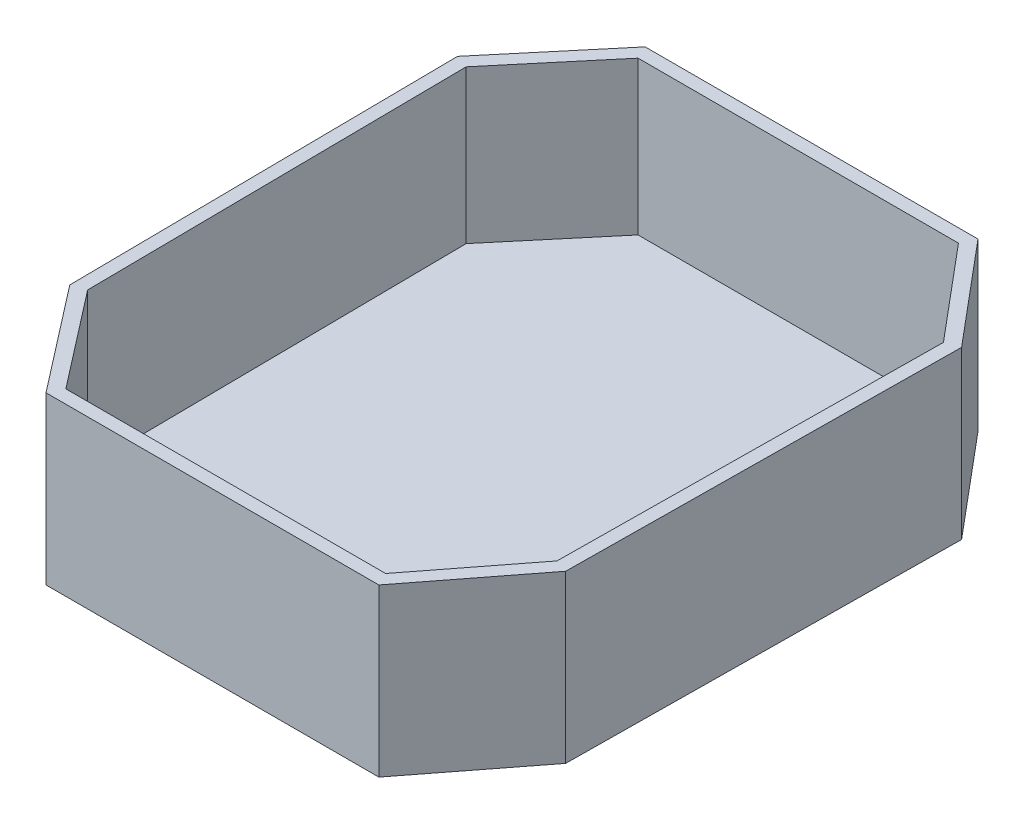
ISO-10303-21;
HEADER;
FILE_DESCRIPTION(('STEP AP214'),'2;1');
FILE_NAME('part.step','',(''),(''),'','','');
FILE_SCHEMA(('AUTOMOTIVE_DESIGN { 1 0 10303 214 1 1 1 1 }'));
ENDSEC;
DATA;
#1=APPLICATION_CONTEXT('core data for automotive mechanical design processes');
#2=APPLICATION_PROTOCOL_DEFINITION('international standard','automotive_design',2000,#1);
#3=PRODUCT_CONTEXT('',#1,'mechanical');
#4=PRODUCT('Part','Part','',(#3));
#5=PRODUCT_RELATED_PRODUCT_CATEGORY('part','',(#4));
#6=PRODUCT_DEFINITION_FORMATION('','',#4);
#7=PRODUCT_DEFINITION_CONTEXT('part definition',#1,'design');
#8=PRODUCT_DEFINITION('design','',#6,#7);
#9=PRODUCT_DEFINITION_SHAPE('','',#8);
#10=(LENGTH_UNIT() NAMED_UNIT(*) SI_UNIT(.MILLI.,.METRE.));
#11=(NAMED_UNIT(*) PLANE_ANGLE_UNIT() SI_UNIT($,.RADIAN.));
#12=(NAMED_UNIT(*) SI_UNIT($,.STERADIAN.) SOLID_ANGLE_UNIT());
#13=UNCERTAINTY_MEASURE_WITH_UNIT(LENGTH_MEASURE(1.E-05),#10,'distance_accuracy_value','');
#14=(GEOMETRIC_REPRESENTATION_CONTEXT(3) GLOBAL_UNCERTAINTY_ASSIGNED_CONTEXT((#13)) GLOBAL_UNIT_ASSIGNED_CONTEXT((#10,
#11,#12)) REPRESENTATION_CONTEXT('',''));
#15=CARTESIAN_POINT('',(0.,0.,0.));
#16=DIRECTION('',(0.,0.,1.));
#17=DIRECTION('',(1.,0.,0.));
#18=AXIS2_PLACEMENT_3D('',#15,#16,#17);
#19=CARTESIAN_POINT('',(0.,25.,0.));
#20=DIRECTION('',(0.,-1.,0.));
#21=DIRECTION('',(0.,0.,-1.));
#22=AXIS2_PLACEMENT_3D('',#19,#20,#21);
#23=PLANE('',#22);
#24=DIRECTION('',(1.,0.,0.));
#25=VECTOR('',#24,1.);
#26=CARTESIAN_POINT('',(0.,25.,50.1713553762138));
#27=LINE('',#26,#25);
#28=CARTESIAN_POINT('',(-25.,25.,50.1713553762139));
#29=VERTEX_POINT('',#28);
#30=CARTESIAN_POINT('',(25.,25.,50.1713553762139));
#31=VERTEX_POINT('',#30);
#32=EDGE_CURVE('E265',#29,#31,#27,.T.);
#33=ORIENTED_EDGE('',*,*,#32,.T.);
#34=DIRECTION('',(-0.612214149349161,0.,0.790691997769475));
#35=VECTOR('',#34,1.);
#36=CARTESIAN_POINT('',(25.,25.,50.1713553762139));
#37=LINE('',#36,#35);
#38=CARTESIAN_POINT('',(37.2442829869832,25.,34.3575154208243));
#39=VERTEX_POINT('',#38);
#40=EDGE_CURVE('E230',#39,#31,#37,.T.);
#41=ORIENTED_EDGE('',*,*,#40,.F.);
#42=DIRECTION('',(-0.0103870449869071,0.,0.999946053193091));
#43=VECTOR('',#42,1.);
#44=CARTESIAN_POINT('',(37.2442829869832,25.,34.3575154208243));
#45=LINE('',#44,#43);
#46=CARTESIAN_POINT('',(37.8557521937308,25.,-24.5077557614065));
#47=VERTEX_POINT('',#46);
#48=EDGE_CURVE('E233',#47,#39,#45,.T.);
#49=ORIENTED_EDGE('',*,*,#48,.F.);
#50=DIRECTION('',(0.642787609686537,0.,0.76604444311898));
#51=VECTOR('',#50,1.);
#52=CARTESIAN_POINT('',(37.8557521937308,25.,-24.5077557614065));
#53=LINE('',#52,#51);
#54=CARTESIAN_POINT('',(25.,25.,-39.8286446237862));
#55=VERTEX_POINT('',#54);
#56=EDGE_CURVE('E237',#55,#47,#53,.T.);
#57=ORIENTED_EDGE('',*,*,#56,.F.);
#58=DIRECTION('',(-1.,0.,0.));
#59=VECTOR('',#58,1.);
#60=CARTESIAN_POINT('',(-25.,25.,-39.8286446237862));
#61=LINE('',#60,#59);
#62=CARTESIAN_POINT('',(-25.,25.,-39.8286446237862));
#63=VERTEX_POINT('',#62);
#64=EDGE_CURVE('E89',#55,#63,#61,.T.);
#65=ORIENTED_EDGE('',*,*,#64,.T.);
#66=DIRECTION('',(-0.642787609686537,0.,0.76604444311898));
#67=VECTOR('',#66,1.);
#68=CARTESIAN_POINT('',(-37.8557521937308,25.,-24.5077557614065));
#69=LINE('',#68,#67);
#70=CARTESIAN_POINT('',(-37.8557521937308,25.,-24.5077557614065));
#71=VERTEX_POINT('',#70);
#72=EDGE_CURVE('E259',#63,#71,#69,.T.);
#73=ORIENTED_EDGE('',*,*,#72,.T.);
#74=DIRECTION('',(0.0103870449869071,0.,0.999946053193091));
#75=VECTOR('',#74,1.);
#76=CARTESIAN_POINT('',(-37.2442829869832,25.,34.3575154208243));
#77=LINE('',#76,#75);
#78=CARTESIAN_POINT('',(-37.2442829869832,25.,34.3575154208243));
#79=VERTEX_POINT('',#78);
#80=EDGE_CURVE('E262',#71,#79,#77,.T.);
#81=ORIENTED_EDGE('',*,*,#80,.T.);
#82=DIRECTION('',(0.612214149349161,0.,0.790691997769475));
#83=VECTOR('',#82,1.);
#84=CARTESIAN_POINT('',(-25.,25.,50.1713553762139));
#85=LINE('',#84,#83);
#86=EDGE_CURVE('E61',#79,#29,#85,.T.);
#87=ORIENTED_EDGE('',*,*,#86,.T.);
#88=EDGE_LOOP('',(#33,#41,#49,#57,#65,#73,#81,#87));
#89=FACE_BOUND('',#88,.T.);
#90=DIRECTION('',(1.,0.,0.));
#91=VECTOR('',#90,1.);
#92=CARTESIAN_POINT('',(0.,25.,48.1713553762138));
#93=LINE('',#92,#91);
#94=CARTESIAN_POINT('',(-24.0191228651744,25.,48.1713553762139));
#95=VERTEX_POINT('',#94);
#96=CARTESIAN_POINT('',(24.0191228651744,25.,48.1713553762138));
#97=VERTEX_POINT('',#96);
#98=EDGE_CURVE('E198',#95,#97,#93,.T.);
#99=ORIENTED_EDGE('',*,*,#98,.F.);
#100=DIRECTION('',(0.612214149349161,0.,0.790691997769475));
#101=VECTOR('',#100,1.);
#102=CARTESIAN_POINT('',(-38.3350518101554,25.,29.6819257061113));
#103=LINE('',#102,#101);
#104=CARTESIAN_POINT('',(-35.2513729786307,25.,33.6645846798867));
#105=VERTEX_POINT('',#104);
#106=EDGE_CURVE('E219',#105,#95,#103,.T.);
#107=ORIENTED_EDGE('',*,*,#106,.F.);
#108=DIRECTION('',(0.0103870449869071,0.,0.999946053193091));
#109=VECTOR('',#108,1.);
#110=CARTESIAN_POINT('',(-35.5972263748545,25.,0.369769939672266));
#111=LINE('',#110,#109);
#112=CARTESIAN_POINT('',(-35.8481765187902,25.,-23.7888436307009));
#113=VERTEX_POINT('',#112);
#114=EDGE_CURVE('E217',#113,#105,#111,.T.);
#115=ORIENTED_EDGE('',*,*,#114,.F.);
#116=DIRECTION('',(-0.642787609686537,0.,0.76604444311898));
#117=VECTOR('',#116,1.);
#118=CARTESIAN_POINT('',(-32.750292343335,25.,-27.4807582262404));
#119=LINE('',#118,#117);
#120=CARTESIAN_POINT('',(-24.06738468369,25.,-37.8286446237861));
#121=VERTEX_POINT('',#120);
#122=EDGE_CURVE('E215',#121,#113,#119,.T.);
#123=ORIENTED_EDGE('',*,*,#122,.F.);
#124=DIRECTION('',(-1.,0.,0.));
#125=VECTOR('',#124,1.);
#126=CARTESIAN_POINT('',(0.,25.,-37.8286446237861));
#127=LINE('',#126,#125);
#128=CARTESIAN_POINT('',(24.06738468369,25.,-37.8286446237861));
#129=VERTEX_POINT('',#128);
#130=EDGE_CURVE('E175',#129,#121,#127,.T.);
#131=ORIENTED_EDGE('',*,*,#130,.F.);
#132=DIRECTION('',(0.642787609686537,0.,0.76604444311898));
#133=VECTOR('',#132,1.);
#134=CARTESIAN_POINT('',(32.750292343335,25.,-27.4807582262404));
#135=LINE('',#134,#133);
#136=CARTESIAN_POINT('',(35.8481765187902,25.,-23.7888436307009));
#137=VERTEX_POINT('',#136);
#138=EDGE_CURVE('E227',#129,#137,#135,.T.);
#139=ORIENTED_EDGE('',*,*,#138,.T.);
#140=DIRECTION('',(-0.0103870449869071,0.,0.999946053193091));
#141=VECTOR('',#140,1.);
#142=CARTESIAN_POINT('',(35.5972263748545,25.,0.369769939672266));
#143=LINE('',#142,#141);
#144=CARTESIAN_POINT('',(35.2513729786307,25.,33.6645846798867));
#145=VERTEX_POINT('',#144);
#146=EDGE_CURVE('E224',#137,#145,#143,.T.);
#147=ORIENTED_EDGE('',*,*,#146,.T.);
#148=DIRECTION('',(-0.612214149349161,0.,0.790691997769475));
#149=VECTOR('',#148,1.);
#150=CARTESIAN_POINT('',(38.3350518101554,25.,29.6819257061113));
#151=LINE('',#150,#149);
#152=EDGE_CURVE('E204',#145,#97,#151,.T.);
#153=ORIENTED_EDGE('',*,*,#152,.T.);
#154=EDGE_LOOP('',(#99,#107,#115,#123,#131,#139,#147,#153));
#155=FACE_BOUND('',#154,.T.);
#156=ADVANCED_FACE('F37',(#89,#155),#23,.F.);
#157=CARTESIAN_POINT('',(-25.,25.,-39.8286446237862));
#158=DIRECTION('',(0.,0.,1.));
#159=DIRECTION('',(1.,0.,0.));
#160=AXIS2_PLACEMENT_3D('',#157,#158,#159);
#161=PLANE('',#160);
#162=DIRECTION('',(-1.,0.,0.));
#163=VECTOR('',#162,1.);
#164=CARTESIAN_POINT('',(-25.,0.,-39.8286446237862));
#165=LINE('',#164,#163);
#166=CARTESIAN_POINT('',(25.,0.,-39.8286446237862));
#167=VERTEX_POINT('',#166);
#168=CARTESIAN_POINT('',(-25.,0.,-39.8286446237862));
#169=VERTEX_POINT('',#168);
#170=EDGE_CURVE('E257',#167,#169,#165,.T.);
#171=ORIENTED_EDGE('',*,*,#170,.T.);
#172=DIRECTION('',(0.,-1.,0.));
#173=VECTOR('',#172,1.);
#174=CARTESIAN_POINT('',(-25.,25.,-39.8286446237862));
#175=LINE('',#174,#173);
#176=EDGE_CURVE('E11',#63,#169,#175,.T.);
#177=ORIENTED_EDGE('',*,*,#176,.F.);
#178=ORIENTED_EDGE('',*,*,#64,.F.);
#179=DIRECTION('',(0.,-1.,0.));
#180=VECTOR('',#179,1.);
#181=CARTESIAN_POINT('',(25.,25.,-39.8286446237862));
#182=LINE('',#181,#180);
#183=EDGE_CURVE('E240',#55,#167,#182,.T.);
#184=ORIENTED_EDGE('',*,*,#183,.T.);
#185=EDGE_LOOP('',(#171,#177,#178,#184));
#186=FACE_BOUND('',#185,.T.);
#187=ADVANCED_FACE('F39',(#186),#161,.F.);
#188=CARTESIAN_POINT('',(-37.8557521937308,25.,-24.5077557614065));
#189=DIRECTION('',(0.76604444311898,0.,0.642787609686537));
#190=DIRECTION('',(0.642787609686537,0.,-0.76604444311898));
#191=AXIS2_PLACEMENT_3D('',#188,#189,#190);
#192=PLANE('',#191);
#193=DIRECTION('',(-0.642787609686537,0.,0.76604444311898));
#194=VECTOR('',#193,1.);
#195=CARTESIAN_POINT('',(-37.8557521937308,0.,-24.5077557614065));
#196=LINE('',#195,#194);
#197=CARTESIAN_POINT('',(-37.8557521937308,0.,-24.5077557614065));
#198=VERTEX_POINT('',#197);
#199=EDGE_CURVE('E269',#169,#198,#196,.T.);
#200=ORIENTED_EDGE('',*,*,#199,.T.);
#201=DIRECTION('',(0.,-1.,0.));
#202=VECTOR('',#201,1.);
#203=CARTESIAN_POINT('',(-37.8557521937308,25.,-24.5077557614065));
#204=LINE('',#203,#202);
#205=EDGE_CURVE('E45',#71,#198,#204,.T.);
#206=ORIENTED_EDGE('',*,*,#205,.F.);
#207=ORIENTED_EDGE('',*,*,#72,.F.);
#208=ORIENTED_EDGE('',*,*,#176,.T.);
#209=EDGE_LOOP('',(#200,#206,#207,#208));
#210=FACE_BOUND('',#209,.T.);
#211=ADVANCED_FACE('F308',(#210),#192,.F.);
#212=CARTESIAN_POINT('',(-37.2442829869832,25.,34.3575154208243));
#213=DIRECTION('',(0.999946053193091,0.,-0.0103870449869071));
#214=DIRECTION('',(-0.0103870449869071,0.,-0.999946053193091));
#215=AXIS2_PLACEMENT_3D('',#212,#213,#214);
#216=PLANE('',#215);
#217=DIRECTION('',(0.0103870449869071,0.,0.999946053193091));
#218=VECTOR('',#217,1.);
#219=CARTESIAN_POINT('',(-37.2442829869832,0.,34.3575154208243));
#220=LINE('',#219,#218);
#221=CARTESIAN_POINT('',(-37.2442829869832,0.,34.3575154208243));
#222=VERTEX_POINT('',#221);
#223=EDGE_CURVE('E271',#198,#222,#220,.T.);
#224=ORIENTED_EDGE('',*,*,#223,.T.);
#225=DIRECTION('',(0.,-1.,0.));
#226=VECTOR('',#225,1.);
#227=CARTESIAN_POINT('',(-37.2442829869832,25.,34.3575154208243));
#228=LINE('',#227,#226);
#229=EDGE_CURVE('E276',#79,#222,#228,.T.);
#230=ORIENTED_EDGE('',*,*,#229,.F.);
#231=ORIENTED_EDGE('',*,*,#80,.F.);
#232=ORIENTED_EDGE('',*,*,#205,.T.);
#233=EDGE_LOOP('',(#224,#230,#231,#232));
#234=FACE_BOUND('',#233,.T.);
#235=ADVANCED_FACE('F282',(#234),#216,.F.);
#236=CARTESIAN_POINT('',(-25.,25.,50.1713553762139));
#237=DIRECTION('',(0.790691997769475,0.,-0.612214149349161));
#238=DIRECTION('',(-0.612214149349161,0.,-0.790691997769475));
#239=AXIS2_PLACEMENT_3D('',#236,#237,#238);
#240=PLANE('',#239);
#241=DIRECTION('',(0.612214149349161,0.,0.790691997769475));
#242=VECTOR('',#241,1.);
#243=CARTESIAN_POINT('',(-25.,0.,50.1713553762139));
#244=LINE('',#243,#242);
#245=CARTESIAN_POINT('',(-25.,0.,50.1713553762139));
#246=VERTEX_POINT('',#245);
#247=EDGE_CURVE('E82',#222,#246,#244,.T.);
#248=ORIENTED_EDGE('',*,*,#247,.T.);
#249=DIRECTION('',(0.,-1.,0.));
#250=VECTOR('',#249,1.);
#251=CARTESIAN_POINT('',(-25.,25.,50.1713553762139));
#252=LINE('',#251,#250);
#253=EDGE_CURVE('E267',#29,#246,#252,.T.);
#254=ORIENTED_EDGE('',*,*,#253,.F.);
#255=ORIENTED_EDGE('',*,*,#86,.F.);
#256=ORIENTED_EDGE('',*,*,#229,.T.);
#257=EDGE_LOOP('',(#248,#254,#255,#256));
#258=FACE_BOUND('',#257,.T.);
#259=ADVANCED_FACE('F309',(#258),#240,.F.);
#260=CARTESIAN_POINT('',(0.,25.,50.1713553762138));
#261=DIRECTION('',(0.,0.,-1.));
#262=DIRECTION('',(-1.,0.,0.));
#263=AXIS2_PLACEMENT_3D('',#260,#261,#262);
#264=PLANE('',#263);
#265=DIRECTION('',(1.,0.,0.));
#266=VECTOR('',#265,1.);
#267=CARTESIAN_POINT('',(0.,0.,50.1713553762138));
#268=LINE('',#267,#266);
#269=CARTESIAN_POINT('',(25.,0.,50.1713553762139));
#270=VERTEX_POINT('',#269);
#271=EDGE_CURVE('E260',#246,#270,#268,.T.);
#272=ORIENTED_EDGE('',*,*,#271,.T.);
#273=DIRECTION('',(0.,-1.,0.));
#274=VECTOR('',#273,1.);
#275=CARTESIAN_POINT('',(25.,25.,50.1713553762139));
#276=LINE('',#275,#274);
#277=EDGE_CURVE('E254',#31,#270,#276,.T.);
#278=ORIENTED_EDGE('',*,*,#277,.F.);
#279=ORIENTED_EDGE('',*,*,#32,.F.);
#280=ORIENTED_EDGE('',*,*,#253,.T.);
#281=EDGE_LOOP('',(#272,#278,#279,#280));
#282=FACE_BOUND('',#281,.T.);
#283=ADVANCED_FACE('F293',(#282),#264,.F.);
#284=CARTESIAN_POINT('',(0.,0.,0.));
#285=DIRECTION('',(0.,-1.,0.));
#286=DIRECTION('',(0.,0.,-1.));
#287=AXIS2_PLACEMENT_3D('',#284,#285,#286);
#288=PLANE('',#287);
#289=ORIENTED_EDGE('',*,*,#170,.F.);
#290=DIRECTION('',(0.642787609686537,0.,0.76604444311898));
#291=VECTOR('',#290,1.);
#292=CARTESIAN_POINT('',(37.8557521937308,0.,-24.5077557614065));
#293=LINE('',#292,#291);
#294=CARTESIAN_POINT('',(37.8557521937308,0.,-24.5077557614065));
#295=VERTEX_POINT('',#294);
#296=EDGE_CURVE('E234',#167,#295,#293,.T.);
#297=ORIENTED_EDGE('',*,*,#296,.T.);
#298=DIRECTION('',(-0.0103870449869071,0.,0.999946053193091));
#299=VECTOR('',#298,1.);
#300=CARTESIAN_POINT('',(37.2442829869832,0.,34.3575154208243));
#301=LINE('',#300,#299);
#302=CARTESIAN_POINT('',(37.2442829869832,0.,34.3575154208243));
#303=VERTEX_POINT('',#302);
#304=EDGE_CURVE('E243',#295,#303,#301,.T.);
#305=ORIENTED_EDGE('',*,*,#304,.T.);
#306=DIRECTION('',(-0.612214149349161,0.,0.790691997769475));
#307=VECTOR('',#306,1.);
#308=CARTESIAN_POINT('',(25.,0.,50.1713553762139));
#309=LINE('',#308,#307);
#310=EDGE_CURVE('E178',#303,#270,#309,.T.);
#311=ORIENTED_EDGE('',*,*,#310,.T.);
#312=ORIENTED_EDGE('',*,*,#271,.F.);
#313=ORIENTED_EDGE('',*,*,#247,.F.);
#314=ORIENTED_EDGE('',*,*,#223,.F.);
#315=ORIENTED_EDGE('',*,*,#199,.F.);
#316=EDGE_LOOP('',(#289,#297,#305,#311,#312,#313,#314,#315));
#317=FACE_BOUND('',#316,.T.);
#318=ADVANCED_FACE('F288',(#317),#288,.T.);
#319=CARTESIAN_POINT('',(25.,25.,50.1713553762139));
#320=DIRECTION('',(0.790691997769475,0.,0.612214149349161));
#321=DIRECTION('',(0.612214149349161,0.,-0.790691997769475));
#322=AXIS2_PLACEMENT_3D('',#319,#320,#321);
#323=PLANE('',#322);
#324=ORIENTED_EDGE('',*,*,#310,.F.);
#325=DIRECTION('',(0.,-1.,0.));
#326=VECTOR('',#325,1.);
#327=CARTESIAN_POINT('',(37.2442829869832,25.,34.3575154208243));
#328=LINE('',#327,#326);
#329=EDGE_CURVE('E252',#39,#303,#328,.T.);
#330=ORIENTED_EDGE('',*,*,#329,.F.);
#331=ORIENTED_EDGE('',*,*,#40,.T.);
#332=ORIENTED_EDGE('',*,*,#277,.T.);
#333=EDGE_LOOP('',(#324,#330,#331,#332));
#334=FACE_BOUND('',#333,.T.);
#335=ADVANCED_FACE('F296',(#334),#323,.T.);
#336=CARTESIAN_POINT('',(37.2442829869832,25.,34.3575154208243));
#337=DIRECTION('',(0.999946053193091,0.,0.0103870449869071));
#338=DIRECTION('',(0.0103870449869071,0.,-0.999946053193091));
#339=AXIS2_PLACEMENT_3D('',#336,#337,#338);
#340=PLANE('',#339);
#341=ORIENTED_EDGE('',*,*,#304,.F.);
#342=DIRECTION('',(0.,-1.,0.));
#343=VECTOR('',#342,1.);
#344=CARTESIAN_POINT('',(37.8557521937308,25.,-24.5077557614065));
#345=LINE('',#344,#343);
#346=EDGE_CURVE('E250',#47,#295,#345,.T.);
#347=ORIENTED_EDGE('',*,*,#346,.F.);
#348=ORIENTED_EDGE('',*,*,#48,.T.);
#349=ORIENTED_EDGE('',*,*,#329,.T.);
#350=EDGE_LOOP('',(#341,#347,#348,#349));
#351=FACE_BOUND('',#350,.T.);
#352=ADVANCED_FACE('F302',(#351),#340,.T.);
#353=CARTESIAN_POINT('',(37.8557521937308,25.,-24.5077557614065));
#354=DIRECTION('',(0.76604444311898,0.,-0.642787609686537));
#355=DIRECTION('',(-0.642787609686537,0.,-0.76604444311898));
#356=AXIS2_PLACEMENT_3D('',#353,#354,#355);
#357=PLANE('',#356);
#358=ORIENTED_EDGE('',*,*,#296,.F.);
#359=ORIENTED_EDGE('',*,*,#183,.F.);
#360=ORIENTED_EDGE('',*,*,#56,.T.);
#361=ORIENTED_EDGE('',*,*,#346,.T.);
#362=EDGE_LOOP('',(#358,#359,#360,#361));
#363=FACE_BOUND('',#362,.T.);
#364=ADVANCED_FACE('F305',(#363),#357,.T.);
#365=CARTESIAN_POINT('',(-25.,25.,-37.8286446237861));
#366=DIRECTION('',(0.,0.,1.));
#367=DIRECTION('',(1.,0.,0.));
#368=AXIS2_PLACEMENT_3D('',#365,#366,#367);
#369=PLANE('',#368);
#370=DIRECTION('',(-1.,0.,0.));
#371=VECTOR('',#370,1.);
#372=CARTESIAN_POINT('',(0.,2.,-37.8286446237861));
#373=LINE('',#372,#371);
#374=CARTESIAN_POINT('',(24.06738468369,2.,-37.8286446237861));
#375=VERTEX_POINT('',#374);
#376=CARTESIAN_POINT('',(-24.06738468369,2.,-37.8286446237861));
#377=VERTEX_POINT('',#376);
#378=EDGE_CURVE('E158',#375,#377,#373,.T.);
#379=ORIENTED_EDGE('',*,*,#378,.F.);
#380=DIRECTION('',(0.,-1.,0.));
#381=VECTOR('',#380,1.);
#382=CARTESIAN_POINT('',(24.06738468369,25.,-37.8286446237861));
#383=LINE('',#382,#381);
#384=EDGE_CURVE('E190',#129,#375,#383,.T.);
#385=ORIENTED_EDGE('',*,*,#384,.F.);
#386=ORIENTED_EDGE('',*,*,#130,.T.);
#387=DIRECTION('',(0.,-1.,0.));
#388=VECTOR('',#387,1.);
#389=CARTESIAN_POINT('',(-24.06738468369,25.,-37.8286446237861));
#390=LINE('',#389,#388);
#391=EDGE_CURVE('E172',#121,#377,#390,.T.);
#392=ORIENTED_EDGE('',*,*,#391,.T.);
#393=EDGE_LOOP('',(#379,#385,#386,#392));
#394=FACE_BOUND('',#393,.T.);
#395=ADVANCED_FACE('F173',(#394),#369,.T.);
#396=CARTESIAN_POINT('',(-36.3236633074928,25.,-23.2221805420335));
#397=DIRECTION('',(0.76604444311898,0.,0.642787609686537));
#398=DIRECTION('',(0.642787609686537,0.,-0.76604444311898));
#399=AXIS2_PLACEMENT_3D('',#396,#397,#398);
#400=PLANE('',#399);
#401=DIRECTION('',(-0.642787609686537,0.,0.76604444311898));
#402=VECTOR('',#401,1.);
#403=CARTESIAN_POINT('',(-32.750292343335,2.,-27.4807582262404));
#404=LINE('',#403,#402);
#405=CARTESIAN_POINT('',(-35.8481765187902,2.,-23.7888436307009));
#406=VERTEX_POINT('',#405);
#407=EDGE_CURVE('E162',#377,#406,#404,.T.);
#408=ORIENTED_EDGE('',*,*,#407,.F.);
#409=ORIENTED_EDGE('',*,*,#391,.F.);
#410=ORIENTED_EDGE('',*,*,#122,.T.);
#411=DIRECTION('',(0.,-1.,0.));
#412=VECTOR('',#411,1.);
#413=CARTESIAN_POINT('',(-35.8481765187902,25.,-23.7888436307009));
#414=LINE('',#413,#412);
#415=EDGE_CURVE('E179',#113,#406,#414,.T.);
#416=ORIENTED_EDGE('',*,*,#415,.T.);
#417=EDGE_LOOP('',(#408,#409,#410,#416));
#418=FACE_BOUND('',#417,.T.);
#419=ADVANCED_FACE('F181',(#418),#400,.T.);
#420=CARTESIAN_POINT('',(-35.244390880597,25.,34.3367413308505));
#421=DIRECTION('',(0.999946053193091,0.,-0.0103870449869071));
#422=DIRECTION('',(-0.0103870449869071,0.,-0.999946053193091));
#423=AXIS2_PLACEMENT_3D('',#420,#421,#422);
#424=PLANE('',#423);
#425=DIRECTION('',(0.0103870449869071,0.,0.999946053193091));
#426=VECTOR('',#425,1.);
#427=CARTESIAN_POINT('',(-35.5972263748545,2.,0.369769939672266));
#428=LINE('',#427,#426);
#429=CARTESIAN_POINT('',(-35.2513729786307,2.,33.6645846798867));
#430=VERTEX_POINT('',#429);
#431=EDGE_CURVE('E184',#406,#430,#428,.T.);
#432=ORIENTED_EDGE('',*,*,#431,.F.);
#433=ORIENTED_EDGE('',*,*,#415,.F.);
#434=ORIENTED_EDGE('',*,*,#114,.T.);
#435=DIRECTION('',(0.,-1.,0.));
#436=VECTOR('',#435,1.);
#437=CARTESIAN_POINT('',(-35.2513729786307,25.,33.6645846798867));
#438=LINE('',#437,#436);
#439=EDGE_CURVE('E52',#105,#430,#438,.T.);
#440=ORIENTED_EDGE('',*,*,#439,.T.);
#441=EDGE_LOOP('',(#432,#433,#434,#440));
#442=FACE_BOUND('',#441,.T.);
#443=ADVANCED_FACE('F359',(#442),#424,.T.);
#444=CARTESIAN_POINT('',(-23.418616004461,25.,48.9469270775155));
#445=DIRECTION('',(0.790691997769475,0.,-0.612214149349161));
#446=DIRECTION('',(-0.612214149349161,0.,-0.790691997769475));
#447=AXIS2_PLACEMENT_3D('',#444,#445,#446);
#448=PLANE('',#447);
#449=DIRECTION('',(0.612214149349161,0.,0.790691997769475));
#450=VECTOR('',#449,1.);
#451=CARTESIAN_POINT('',(-38.3350518101554,2.,29.6819257061113));
#452=LINE('',#451,#450);
#453=CARTESIAN_POINT('',(-24.0191228651744,2.,48.1713553762139));
#454=VERTEX_POINT('',#453);
#455=EDGE_CURVE('E186',#430,#454,#452,.T.);
#456=ORIENTED_EDGE('',*,*,#455,.F.);
#457=ORIENTED_EDGE('',*,*,#439,.F.);
#458=ORIENTED_EDGE('',*,*,#106,.T.);
#459=DIRECTION('',(0.,-1.,0.));
#460=VECTOR('',#459,1.);
#461=CARTESIAN_POINT('',(-24.0191228651744,25.,48.1713553762139));
#462=LINE('',#461,#460);
#463=EDGE_CURVE('E193',#95,#454,#462,.T.);
#464=ORIENTED_EDGE('',*,*,#463,.T.);
#465=EDGE_LOOP('',(#456,#457,#458,#464));
#466=FACE_BOUND('',#465,.T.);
#467=ADVANCED_FACE('F355',(#466),#448,.T.);
#468=CARTESIAN_POINT('',(0.,25.,48.1713553762138));
#469=DIRECTION('',(0.,0.,-1.));
#470=DIRECTION('',(-1.,0.,0.));
#471=AXIS2_PLACEMENT_3D('',#468,#469,#470);
#472=PLANE('',#471);
#473=DIRECTION('',(1.,0.,0.));
#474=VECTOR('',#473,1.);
#475=CARTESIAN_POINT('',(0.,2.,48.1713553762138));
#476=LINE('',#475,#474);
#477=CARTESIAN_POINT('',(24.0191228651744,2.,48.1713553762138));
#478=VERTEX_POINT('',#477);
#479=EDGE_CURVE('E195',#454,#478,#476,.T.);
#480=ORIENTED_EDGE('',*,*,#479,.F.);
#481=ORIENTED_EDGE('',*,*,#463,.F.);
#482=ORIENTED_EDGE('',*,*,#98,.T.);
#483=DIRECTION('',(0.,-1.,0.));
#484=VECTOR('',#483,1.);
#485=CARTESIAN_POINT('',(24.0191228651744,25.,48.1713553762138));
#486=LINE('',#485,#484);
#487=EDGE_CURVE('E169',#97,#478,#486,.T.);
#488=ORIENTED_EDGE('',*,*,#487,.T.);
#489=EDGE_LOOP('',(#480,#481,#482,#488));
#490=FACE_BOUND('',#489,.T.);
#491=ADVANCED_FACE('F352',(#490),#472,.T.);
#492=CARTESIAN_POINT('',(0.,2.,0.));
#493=DIRECTION('',(0.,-1.,0.));
#494=DIRECTION('',(0.,0.,-1.));
#495=AXIS2_PLACEMENT_3D('',#492,#493,#494);
#496=PLANE('',#495);
#497=ORIENTED_EDGE('',*,*,#378,.T.);
#498=ORIENTED_EDGE('',*,*,#407,.T.);
#499=ORIENTED_EDGE('',*,*,#431,.T.);
#500=ORIENTED_EDGE('',*,*,#455,.T.);
#501=ORIENTED_EDGE('',*,*,#479,.T.);
#502=DIRECTION('',(-0.612214149349161,0.,0.790691997769475));
#503=VECTOR('',#502,1.);
#504=CARTESIAN_POINT('',(38.3350518101554,2.,29.6819257061113));
#505=LINE('',#504,#503);
#506=CARTESIAN_POINT('',(35.2513729786307,2.,33.6645846798867));
#507=VERTEX_POINT('',#506);
#508=EDGE_CURVE('E208',#507,#478,#505,.T.);
#509=ORIENTED_EDGE('',*,*,#508,.F.);
#510=DIRECTION('',(-0.0103870449869071,0.,0.999946053193091));
#511=VECTOR('',#510,1.);
#512=CARTESIAN_POINT('',(35.5972263748545,2.,0.369769939672266));
#513=LINE('',#512,#511);
#514=CARTESIAN_POINT('',(35.8481765187902,2.,-23.7888436307009));
#515=VERTEX_POINT('',#514);
#516=EDGE_CURVE('E205',#515,#507,#513,.T.);
#517=ORIENTED_EDGE('',*,*,#516,.F.);
#518=DIRECTION('',(0.642787609686537,0.,0.76604444311898));
#519=VECTOR('',#518,1.);
#520=CARTESIAN_POINT('',(32.750292343335,2.,-27.4807582262404));
#521=LINE('',#520,#519);
#522=EDGE_CURVE('E166',#375,#515,#521,.T.);
#523=ORIENTED_EDGE('',*,*,#522,.F.);
#524=EDGE_LOOP('',(#497,#498,#499,#500,#501,#509,#517,#523));
#525=FACE_BOUND('',#524,.T.);
#526=ADVANCED_FACE('F160',(#525),#496,.F.);
#527=CARTESIAN_POINT('',(23.418616004461,25.,48.9469270775155));
#528=DIRECTION('',(0.790691997769475,0.,0.612214149349161));
#529=DIRECTION('',(0.612214149349161,0.,-0.790691997769475));
#530=AXIS2_PLACEMENT_3D('',#527,#528,#529);
#531=PLANE('',#530);
#532=ORIENTED_EDGE('',*,*,#508,.T.);
#533=ORIENTED_EDGE('',*,*,#487,.F.);
#534=ORIENTED_EDGE('',*,*,#152,.F.);
#535=DIRECTION('',(0.,-1.,0.));
#536=VECTOR('',#535,1.);
#537=CARTESIAN_POINT('',(35.2513729786307,25.,33.6645846798867));
#538=LINE('',#537,#536);
#539=EDGE_CURVE('E202',#145,#507,#538,.T.);
#540=ORIENTED_EDGE('',*,*,#539,.T.);
#541=EDGE_LOOP('',(#532,#533,#534,#540));
#542=FACE_BOUND('',#541,.T.);
#543=ADVANCED_FACE('F345',(#542),#531,.F.);
#544=CARTESIAN_POINT('',(35.244390880597,25.,34.3367413308505));
#545=DIRECTION('',(0.999946053193091,0.,0.0103870449869071));
#546=DIRECTION('',(0.0103870449869071,0.,-0.999946053193091));
#547=AXIS2_PLACEMENT_3D('',#544,#545,#546);
#548=PLANE('',#547);
#549=ORIENTED_EDGE('',*,*,#516,.T.);
#550=ORIENTED_EDGE('',*,*,#539,.F.);
#551=ORIENTED_EDGE('',*,*,#146,.F.);
#552=DIRECTION('',(0.,-1.,0.));
#553=VECTOR('',#552,1.);
#554=CARTESIAN_POINT('',(35.8481765187902,25.,-23.7888436307009));
#555=LINE('',#554,#553);
#556=EDGE_CURVE('E212',#137,#515,#555,.T.);
#557=ORIENTED_EDGE('',*,*,#556,.T.);
#558=EDGE_LOOP('',(#549,#550,#551,#557));
#559=FACE_BOUND('',#558,.T.);
#560=ADVANCED_FACE('F341',(#559),#548,.F.);
#561=CARTESIAN_POINT('',(36.3236633074928,25.,-23.2221805420335));
#562=DIRECTION('',(0.76604444311898,0.,-0.642787609686537));
#563=DIRECTION('',(-0.642787609686537,0.,-0.76604444311898));
#564=AXIS2_PLACEMENT_3D('',#561,#562,#563);
#565=PLANE('',#564);
#566=ORIENTED_EDGE('',*,*,#522,.T.);
#567=ORIENTED_EDGE('',*,*,#556,.F.);
#568=ORIENTED_EDGE('',*,*,#138,.F.);
#569=ORIENTED_EDGE('',*,*,#384,.T.);
#570=EDGE_LOOP('',(#566,#567,#568,#569));
#571=FACE_BOUND('',#570,.T.);
#572=ADVANCED_FACE('F338',(#571),#565,.F.);
#573=CLOSED_SHELL('',(#156,#187,#211,#235,#259,#283,#318,#335,#352,#364,#395,#419,#443,#467,
#491,#526,#543,#560,#572));
#574=MANIFOLD_SOLID_BREP('B2',#573);
#575=ADVANCED_BREP_SHAPE_REPRESENTATION('',(#18,#574),#14);
#576=SHAPE_DEFINITION_REPRESENTATION(#9,#575);
ENDSEC;
END-ISO-10303-21;
